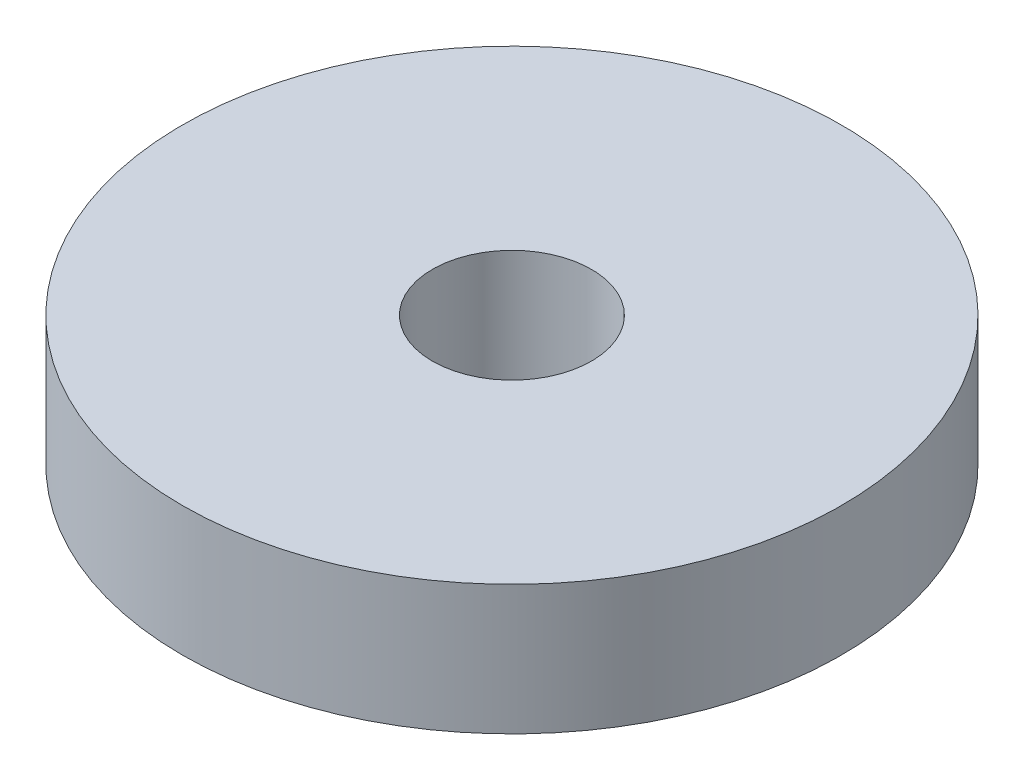
ISO-10303-21;
HEADER;
FILE_DESCRIPTION(('STEP AP214'),'2;1');
FILE_NAME('part.step','',(''),(''),'','','');
FILE_SCHEMA(('AUTOMOTIVE_DESIGN { 1 0 10303 214 1 1 1 1 }'));
ENDSEC;
DATA;
#1=APPLICATION_CONTEXT('core data for automotive mechanical design processes');
#2=APPLICATION_PROTOCOL_DEFINITION('international standard','automotive_design',2000,#1);
#3=PRODUCT_CONTEXT('',#1,'mechanical');
#4=PRODUCT('Part','Part','',(#3));
#5=PRODUCT_RELATED_PRODUCT_CATEGORY('part','',(#4));
#6=PRODUCT_DEFINITION_FORMATION('','',#4);
#7=PRODUCT_DEFINITION_CONTEXT('part definition',#1,'design');
#8=PRODUCT_DEFINITION('design','',#6,#7);
#9=PRODUCT_DEFINITION_SHAPE('','',#8);
#10=(LENGTH_UNIT() NAMED_UNIT(*) SI_UNIT(.MILLI.,.METRE.));
#11=(NAMED_UNIT(*) PLANE_ANGLE_UNIT() SI_UNIT($,.RADIAN.));
#12=(NAMED_UNIT(*) SI_UNIT($,.STERADIAN.) SOLID_ANGLE_UNIT());
#13=UNCERTAINTY_MEASURE_WITH_UNIT(LENGTH_MEASURE(1.E-05),#10,'distance_accuracy_value','');
#14=(GEOMETRIC_REPRESENTATION_CONTEXT(3) GLOBAL_UNCERTAINTY_ASSIGNED_CONTEXT((#13)) GLOBAL_UNIT_ASSIGNED_CONTEXT((#10,
#11,#12)) REPRESENTATION_CONTEXT('',''));
#15=CARTESIAN_POINT('',(0.,0.,0.));
#16=DIRECTION('',(0.,0.,1.));
#17=DIRECTION('',(1.,0.,0.));
#18=AXIS2_PLACEMENT_3D('',#15,#16,#17);
#19=CARTESIAN_POINT('',(0.,2.85,0.));
#20=DIRECTION('',(0.,1.,0.));
#21=DIRECTION('',(0.,0.,1.));
#22=AXIS2_PLACEMENT_3D('',#19,#20,#21);
#23=PLANE('',#22);
#24=CARTESIAN_POINT('',(0.,2.85,0.));
#25=DIRECTION('',(0.,1.,0.));
#26=DIRECTION('',(0.,0.,1.));
#27=AXIS2_PLACEMENT_3D('',#24,#25,#26);
#28=CIRCLE('',#27,7.25);
#29=CARTESIAN_POINT('',(0.,2.85,7.25));
#30=VERTEX_POINT('',#29);
#31=EDGE_CURVE('E10',#30,#30,#28,.T.);
#32=ORIENTED_EDGE('',*,*,#31,.T.);
#33=EDGE_LOOP('',(#32));
#34=FACE_BOUND('',#33,.T.);
#35=CARTESIAN_POINT('',(0.,2.85,0.));
#36=DIRECTION('',(0.,1.,0.));
#37=DIRECTION('',(0.,0.,1.));
#38=AXIS2_PLACEMENT_3D('',#35,#36,#37);
#39=CIRCLE('',#38,1.75);
#40=CARTESIAN_POINT('',(0.,2.85,1.75));
#41=VERTEX_POINT('',#40);
#42=EDGE_CURVE('E42',#41,#41,#39,.T.);
#43=ORIENTED_EDGE('',*,*,#42,.F.);
#44=EDGE_LOOP('',(#43));
#45=FACE_BOUND('',#44,.T.);
#46=ADVANCED_FACE('F31',(#34,#45),#23,.T.);
#47=CARTESIAN_POINT('',(0.,0.,0.));
#48=DIRECTION('',(0.,1.,0.));
#49=DIRECTION('',(0.,0.,1.));
#50=AXIS2_PLACEMENT_3D('',#47,#48,#49);
#51=PLANE('',#50);
#52=CARTESIAN_POINT('',(0.,0.,0.));
#53=DIRECTION('',(0.,1.,0.));
#54=DIRECTION('',(0.,0.,1.));
#55=AXIS2_PLACEMENT_3D('',#52,#53,#54);
#56=CIRCLE('',#55,7.25);
#57=CARTESIAN_POINT('',(0.,0.,7.25));
#58=VERTEX_POINT('',#57);
#59=EDGE_CURVE('E35',#58,#58,#56,.T.);
#60=ORIENTED_EDGE('',*,*,#59,.F.);
#61=EDGE_LOOP('',(#60));
#62=FACE_BOUND('',#61,.T.);
#63=CARTESIAN_POINT('',(0.,0.,0.));
#64=DIRECTION('',(0.,1.,0.));
#65=DIRECTION('',(0.,0.,1.));
#66=AXIS2_PLACEMENT_3D('',#63,#64,#65);
#67=CIRCLE('',#66,1.75);
#68=CARTESIAN_POINT('',(0.,0.,1.75));
#69=VERTEX_POINT('',#68);
#70=EDGE_CURVE('E44',#69,#69,#67,.T.);
#71=ORIENTED_EDGE('',*,*,#70,.T.);
#72=EDGE_LOOP('',(#71));
#73=FACE_BOUND('',#72,.T.);
#74=ADVANCED_FACE('F54',(#62,#73),#51,.F.);
#75=CARTESIAN_POINT('',(0.,2.85,0.));
#76=DIRECTION('',(0.,-1.,0.));
#77=DIRECTION('',(0.,0.,-1.));
#78=AXIS2_PLACEMENT_3D('',#75,#76,#77);
#79=CYLINDRICAL_SURFACE('',#78,7.25);
#80=ORIENTED_EDGE('',*,*,#31,.F.);
#81=EDGE_LOOP('',(#80));
#82=FACE_BOUND('',#81,.T.);
#83=ORIENTED_EDGE('',*,*,#59,.T.);
#84=EDGE_LOOP('',(#83));
#85=FACE_BOUND('',#84,.T.);
#86=ADVANCED_FACE('F33',(#82,#85),#79,.T.);
#87=CARTESIAN_POINT('',(0.,2.85,0.));
#88=DIRECTION('',(0.,-1.,0.));
#89=DIRECTION('',(0.,0.,-1.));
#90=AXIS2_PLACEMENT_3D('',#87,#88,#89);
#91=CYLINDRICAL_SURFACE('',#90,1.75);
#92=ORIENTED_EDGE('',*,*,#42,.T.);
#93=EDGE_LOOP('',(#92));
#94=FACE_BOUND('',#93,.T.);
#95=ORIENTED_EDGE('',*,*,#70,.F.);
#96=EDGE_LOOP('',(#95));
#97=FACE_BOUND('',#96,.T.);
#98=ADVANCED_FACE('F50',(#94,#97),#91,.F.);
#99=CLOSED_SHELL('',(#46,#74,#86,#98));
#100=MANIFOLD_SOLID_BREP('B2',#99);
#101=ADVANCED_BREP_SHAPE_REPRESENTATION('',(#18,#100),#14);
#102=SHAPE_DEFINITION_REPRESENTATION(#9,#101);
ENDSEC;
END-ISO-10303-21;
